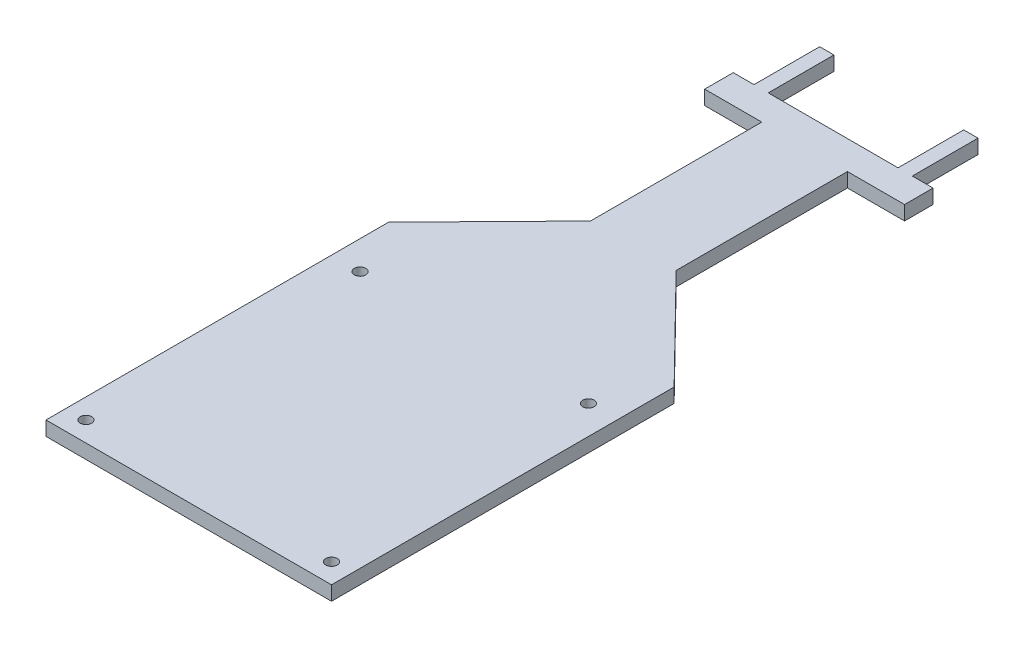
ISO-10303-21;
HEADER;
FILE_DESCRIPTION(('STEP AP214'),'2;1');
FILE_NAME('part.step','',(''),(''),'','','');
FILE_SCHEMA(('AUTOMOTIVE_DESIGN { 1 0 10303 214 1 1 1 1 }'));
ENDSEC;
DATA;
#1=APPLICATION_CONTEXT('core data for automotive mechanical design processes');
#2=APPLICATION_PROTOCOL_DEFINITION('international standard','automotive_design',2000,#1);
#3=PRODUCT_CONTEXT('',#1,'mechanical');
#4=PRODUCT('Part','Part','',(#3));
#5=PRODUCT_RELATED_PRODUCT_CATEGORY('part','',(#4));
#6=PRODUCT_DEFINITION_FORMATION('','',#4);
#7=PRODUCT_DEFINITION_CONTEXT('part definition',#1,'design');
#8=PRODUCT_DEFINITION('design','',#6,#7);
#9=PRODUCT_DEFINITION_SHAPE('','',#8);
#10=(LENGTH_UNIT() NAMED_UNIT(*) SI_UNIT(.MILLI.,.METRE.));
#11=(NAMED_UNIT(*) PLANE_ANGLE_UNIT() SI_UNIT($,.RADIAN.));
#12=(NAMED_UNIT(*) SI_UNIT($,.STERADIAN.) SOLID_ANGLE_UNIT());
#13=UNCERTAINTY_MEASURE_WITH_UNIT(LENGTH_MEASURE(1.E-05),#10,'distance_accuracy_value','');
#14=(GEOMETRIC_REPRESENTATION_CONTEXT(3) GLOBAL_UNCERTAINTY_ASSIGNED_CONTEXT((#13)) GLOBAL_UNIT_ASSIGNED_CONTEXT((#10,
#11,#12)) REPRESENTATION_CONTEXT('',''));
#15=CARTESIAN_POINT('',(0.,0.,0.));
#16=DIRECTION('',(0.,0.,1.));
#17=DIRECTION('',(1.,0.,0.));
#18=AXIS2_PLACEMENT_3D('',#15,#16,#17);
#19=CARTESIAN_POINT('',(0.,5.,0.));
#20=DIRECTION('',(0.,1.,0.));
#21=DIRECTION('',(0.,0.,1.));
#22=AXIS2_PLACEMENT_3D('',#19,#20,#21);
#23=PLANE('',#22);
#24=CARTESIAN_POINT('',(-43.,5.,53.));
#25=DIRECTION('',(0.,1.,0.));
#26=DIRECTION('',(0.,0.,1.));
#27=AXIS2_PLACEMENT_3D('',#24,#25,#26);
#28=CIRCLE('',#27,2.);
#29=CARTESIAN_POINT('',(-43.,5.,55.));
#30=VERTEX_POINT('',#29);
#31=EDGE_CURVE('E470',#30,#30,#28,.T.);
#32=ORIENTED_EDGE('',*,*,#31,.F.);
#33=EDGE_LOOP('',(#32));
#34=FACE_BOUND('',#33,.T.);
#35=CARTESIAN_POINT('',(40.,5.,-40.));
#36=DIRECTION('',(0.,1.,0.));
#37=DIRECTION('',(0.,0.,1.));
#38=AXIS2_PLACEMENT_3D('',#35,#36,#37);
#39=CIRCLE('',#38,2.);
#40=CARTESIAN_POINT('',(40.,5.,-38.));
#41=VERTEX_POINT('',#40);
#42=EDGE_CURVE('E228',#41,#41,#39,.T.);
#43=ORIENTED_EDGE('',*,*,#42,.F.);
#44=EDGE_LOOP('',(#43));
#45=FACE_BOUND('',#44,.T.);
#46=DIRECTION('',(0.,0.,-1.));
#47=VECTOR('',#46,1.);
#48=CARTESIAN_POINT('',(50.,5.,-60.));
#49=LINE('',#48,#47);
#50=CARTESIAN_POINT('',(50.,5.,60.));
#51=VERTEX_POINT('',#50);
#52=CARTESIAN_POINT('',(50.,5.,-60.));
#53=VERTEX_POINT('',#52);
#54=EDGE_CURVE('E282',#51,#53,#49,.T.);
#55=ORIENTED_EDGE('',*,*,#54,.T.);
#56=DIRECTION('',(-0.700000000000001,0.,-0.714142842854284));
#57=VECTOR('',#56,1.);
#58=CARTESIAN_POINT('',(50.,5.,-60.));
#59=LINE('',#58,#57);
#60=CARTESIAN_POINT('',(15.,5.,-95.7071421427142));
#61=VERTEX_POINT('',#60);
#62=EDGE_CURVE('E146',#53,#61,#59,.T.);
#63=ORIENTED_EDGE('',*,*,#62,.T.);
#64=DIRECTION('',(0.,0.,-1.));
#65=VECTOR('',#64,1.);
#66=CARTESIAN_POINT('',(15.,5.,-155.707142142714));
#67=LINE('',#66,#65);
#68=CARTESIAN_POINT('',(15.,5.,-155.707142142714));
#69=VERTEX_POINT('',#68);
#70=EDGE_CURVE('E351',#61,#69,#67,.T.);
#71=ORIENTED_EDGE('',*,*,#70,.T.);
#72=DIRECTION('',(1.,0.,0.));
#73=VECTOR('',#72,1.);
#74=CARTESIAN_POINT('',(35.,5.,-155.707142142714));
#75=LINE('',#74,#73);
#76=CARTESIAN_POINT('',(35.,5.,-155.707142142714));
#77=VERTEX_POINT('',#76);
#78=EDGE_CURVE('E371',#69,#77,#75,.T.);
#79=ORIENTED_EDGE('',*,*,#78,.T.);
#80=DIRECTION('',(0.,0.,-1.));
#81=VECTOR('',#80,1.);
#82=CARTESIAN_POINT('',(35.,5.,-155.707142142714));
#83=LINE('',#82,#81);
#84=CARTESIAN_POINT('',(35.,5.,-165.707142142714));
#85=VERTEX_POINT('',#84);
#86=EDGE_CURVE('E367',#77,#85,#83,.T.);
#87=ORIENTED_EDGE('',*,*,#86,.T.);
#88=DIRECTION('',(-1.,0.,0.));
#89=VECTOR('',#88,1.);
#90=CARTESIAN_POINT('',(27.7289917777717,5.,-165.707142142714));
#91=LINE('',#90,#89);
#92=CARTESIAN_POINT('',(27.7289917777717,5.,-165.707142142714));
#93=VERTEX_POINT('',#92);
#94=EDGE_CURVE('E370',#85,#93,#91,.T.);
#95=ORIENTED_EDGE('',*,*,#94,.T.);
#96=DIRECTION('',(0.,0.,-1.));
#97=VECTOR('',#96,1.);
#98=CARTESIAN_POINT('',(27.7289917777717,5.,-165.707142142714));
#99=LINE('',#98,#97);
#100=CARTESIAN_POINT('',(27.7289917777717,5.,-188.707142142714));
#101=VERTEX_POINT('',#100);
#102=EDGE_CURVE('E375',#93,#101,#99,.T.);
#103=ORIENTED_EDGE('',*,*,#102,.T.);
#104=DIRECTION('',(-1.,0.,0.));
#105=VECTOR('',#104,1.);
#106=CARTESIAN_POINT('',(27.7289917777717,5.,-188.707142142714));
#107=LINE('',#106,#105);
#108=CARTESIAN_POINT('',(22.7289917777717,5.,-188.707142142714));
#109=VERTEX_POINT('',#108);
#110=EDGE_CURVE('E382',#101,#109,#107,.T.);
#111=ORIENTED_EDGE('',*,*,#110,.T.);
#112=DIRECTION('',(0.,0.,1.));
#113=VECTOR('',#112,1.);
#114=CARTESIAN_POINT('',(22.7289917777717,5.,-188.707142142714));
#115=LINE('',#114,#113);
#116=CARTESIAN_POINT('',(22.7289917777717,5.,-165.707142142714));
#117=VERTEX_POINT('',#116);
#118=EDGE_CURVE('E385',#109,#117,#115,.T.);
#119=ORIENTED_EDGE('',*,*,#118,.T.);
#120=DIRECTION('',(-1.,0.,0.));
#121=VECTOR('',#120,1.);
#122=CARTESIAN_POINT('',(-22.7289917777717,5.,-165.707142142714));
#123=LINE('',#122,#121);
#124=CARTESIAN_POINT('',(-22.7289917777717,5.,-165.707142142714));
#125=VERTEX_POINT('',#124);
#126=EDGE_CURVE('E388',#117,#125,#123,.T.);
#127=ORIENTED_EDGE('',*,*,#126,.T.);
#128=DIRECTION('',(0.,0.,-1.));
#129=VECTOR('',#128,1.);
#130=CARTESIAN_POINT('',(-22.7289917777717,5.,-188.707142142714));
#131=LINE('',#130,#129);
#132=CARTESIAN_POINT('',(-22.7289917777717,5.,-188.707142142714));
#133=VERTEX_POINT('',#132);
#134=EDGE_CURVE('E391',#125,#133,#131,.T.);
#135=ORIENTED_EDGE('',*,*,#134,.T.);
#136=DIRECTION('',(-1.,0.,0.));
#137=VECTOR('',#136,1.);
#138=CARTESIAN_POINT('',(-27.7289917777717,5.,-188.707142142714));
#139=LINE('',#138,#137);
#140=CARTESIAN_POINT('',(-27.7289917777717,5.,-188.707142142714));
#141=VERTEX_POINT('',#140);
#142=EDGE_CURVE('E394',#133,#141,#139,.T.);
#143=ORIENTED_EDGE('',*,*,#142,.T.);
#144=DIRECTION('',(0.,0.,1.));
#145=VECTOR('',#144,1.);
#146=CARTESIAN_POINT('',(-27.7289917777717,5.,-165.707142142714));
#147=LINE('',#146,#145);
#148=CARTESIAN_POINT('',(-27.7289917777717,5.,-165.707142142714));
#149=VERTEX_POINT('',#148);
#150=EDGE_CURVE('E397',#141,#149,#147,.T.);
#151=ORIENTED_EDGE('',*,*,#150,.T.);
#152=DIRECTION('',(-1.,0.,0.));
#153=VECTOR('',#152,1.);
#154=CARTESIAN_POINT('',(-35.,5.,-165.707142142714));
#155=LINE('',#154,#153);
#156=CARTESIAN_POINT('',(-35.,5.,-165.707142142714));
#157=VERTEX_POINT('',#156);
#158=EDGE_CURVE('E400',#149,#157,#155,.T.);
#159=ORIENTED_EDGE('',*,*,#158,.T.);
#160=DIRECTION('',(0.,0.,1.));
#161=VECTOR('',#160,1.);
#162=CARTESIAN_POINT('',(-35.,5.,-155.707142142714));
#163=LINE('',#162,#161);
#164=CARTESIAN_POINT('',(-35.,5.,-155.707142142714));
#165=VERTEX_POINT('',#164);
#166=EDGE_CURVE('E403',#157,#165,#163,.T.);
#167=ORIENTED_EDGE('',*,*,#166,.T.);
#168=DIRECTION('',(1.,0.,0.));
#169=VECTOR('',#168,1.);
#170=CARTESIAN_POINT('',(-35.,5.,-155.707142142714));
#171=LINE('',#170,#169);
#172=CARTESIAN_POINT('',(-15.,5.,-155.707142142714));
#173=VERTEX_POINT('',#172);
#174=EDGE_CURVE('E406',#165,#173,#171,.T.);
#175=ORIENTED_EDGE('',*,*,#174,.T.);
#176=DIRECTION('',(0.,0.,1.));
#177=VECTOR('',#176,1.);
#178=CARTESIAN_POINT('',(-15.,5.,-155.707142142714));
#179=LINE('',#178,#177);
#180=CARTESIAN_POINT('',(-15.,5.,-95.7071421427142));
#181=VERTEX_POINT('',#180);
#182=EDGE_CURVE('E201',#173,#181,#179,.T.);
#183=ORIENTED_EDGE('',*,*,#182,.T.);
#184=DIRECTION('',(-0.7,0.,0.714142842854285));
#185=VECTOR('',#184,1.);
#186=CARTESIAN_POINT('',(-50.,5.,-60.));
#187=LINE('',#186,#185);
#188=CARTESIAN_POINT('',(-50.,5.,-60.));
#189=VERTEX_POINT('',#188);
#190=EDGE_CURVE('E195',#181,#189,#187,.T.);
#191=ORIENTED_EDGE('',*,*,#190,.T.);
#192=DIRECTION('',(0.,0.,1.));
#193=VECTOR('',#192,1.);
#194=CARTESIAN_POINT('',(-50.,5.,-60.));
#195=LINE('',#194,#193);
#196=CARTESIAN_POINT('',(-50.,5.,60.));
#197=VERTEX_POINT('',#196);
#198=EDGE_CURVE('E199',#189,#197,#195,.T.);
#199=ORIENTED_EDGE('',*,*,#198,.T.);
#200=DIRECTION('',(1.,0.,0.));
#201=VECTOR('',#200,1.);
#202=CARTESIAN_POINT('',(-50.,5.,60.));
#203=LINE('',#202,#201);
#204=EDGE_CURVE('E67',#197,#51,#203,.T.);
#205=ORIENTED_EDGE('',*,*,#204,.T.);
#206=EDGE_LOOP('',(#55,#63,#71,#79,#87,#95,#103,#111,#119,#127,#135,#143,#151,#159,#167,#175,
#183,#191,#199,#205));
#207=FACE_BOUND('',#206,.T.);
#208=CARTESIAN_POINT('',(-40.,5.,-40.));
#209=DIRECTION('',(0.,1.,0.));
#210=DIRECTION('',(0.,0.,1.));
#211=AXIS2_PLACEMENT_3D('',#208,#209,#210);
#212=CIRCLE('',#211,2.);
#213=CARTESIAN_POINT('',(-40.,5.,-38.));
#214=VERTEX_POINT('',#213);
#215=EDGE_CURVE('E478',#214,#214,#212,.T.);
#216=ORIENTED_EDGE('',*,*,#215,.F.);
#217=EDGE_LOOP('',(#216));
#218=FACE_BOUND('',#217,.T.);
#219=CARTESIAN_POINT('',(43.,5.,52.9999999999999));
#220=DIRECTION('',(0.,1.,0.));
#221=DIRECTION('',(0.,0.,1.));
#222=AXIS2_PLACEMENT_3D('',#219,#220,#221);
#223=CIRCLE('',#222,2.);
#224=CARTESIAN_POINT('',(43.,5.,54.9999999999999));
#225=VERTEX_POINT('',#224);
#226=EDGE_CURVE('E459',#225,#225,#223,.T.);
#227=ORIENTED_EDGE('',*,*,#226,.F.);
#228=EDGE_LOOP('',(#227));
#229=FACE_BOUND('',#228,.T.);
#230=ADVANCED_FACE('F49',(#34,#45,#207,#218,#229),#23,.T.);
#231=CARTESIAN_POINT('',(0.,0.,0.));
#232=DIRECTION('',(0.,1.,0.));
#233=DIRECTION('',(0.,0.,1.));
#234=AXIS2_PLACEMENT_3D('',#231,#232,#233);
#235=PLANE('',#234);
#236=DIRECTION('',(0.,0.,-1.));
#237=VECTOR('',#236,1.);
#238=CARTESIAN_POINT('',(50.,0.,-60.));
#239=LINE('',#238,#237);
#240=CARTESIAN_POINT('',(50.,0.,60.));
#241=VERTEX_POINT('',#240);
#242=CARTESIAN_POINT('',(50.,0.,-60.));
#243=VERTEX_POINT('',#242);
#244=EDGE_CURVE('E223',#241,#243,#239,.T.);
#245=ORIENTED_EDGE('',*,*,#244,.F.);
#246=DIRECTION('',(1.,0.,0.));
#247=VECTOR('',#246,1.);
#248=CARTESIAN_POINT('',(-50.,0.,60.));
#249=LINE('',#248,#247);
#250=CARTESIAN_POINT('',(-50.,0.,60.));
#251=VERTEX_POINT('',#250);
#252=EDGE_CURVE('E138',#251,#241,#249,.T.);
#253=ORIENTED_EDGE('',*,*,#252,.F.);
#254=DIRECTION('',(0.,0.,1.));
#255=VECTOR('',#254,1.);
#256=CARTESIAN_POINT('',(-50.,0.,-60.));
#257=LINE('',#256,#255);
#258=CARTESIAN_POINT('',(-50.,0.,-60.));
#259=VERTEX_POINT('',#258);
#260=EDGE_CURVE('E132',#259,#251,#257,.T.);
#261=ORIENTED_EDGE('',*,*,#260,.F.);
#262=DIRECTION('',(-0.7,0.,0.714142842854285));
#263=VECTOR('',#262,1.);
#264=CARTESIAN_POINT('',(-50.,0.,-60.));
#265=LINE('',#264,#263);
#266=CARTESIAN_POINT('',(-15.,0.,-95.7071421427142));
#267=VERTEX_POINT('',#266);
#268=EDGE_CURVE('E210',#267,#259,#265,.T.);
#269=ORIENTED_EDGE('',*,*,#268,.F.);
#270=DIRECTION('',(0.,0.,1.));
#271=VECTOR('',#270,1.);
#272=CARTESIAN_POINT('',(-15.,0.,-155.707142142714));
#273=LINE('',#272,#271);
#274=CARTESIAN_POINT('',(-15.,0.,-155.707142142714));
#275=VERTEX_POINT('',#274);
#276=EDGE_CURVE('E273',#275,#267,#273,.T.);
#277=ORIENTED_EDGE('',*,*,#276,.F.);
#278=DIRECTION('',(1.,0.,0.));
#279=VECTOR('',#278,1.);
#280=CARTESIAN_POINT('',(-35.,0.,-155.707142142714));
#281=LINE('',#280,#279);
#282=CARTESIAN_POINT('',(-35.,0.,-155.707142142714));
#283=VERTEX_POINT('',#282);
#284=EDGE_CURVE('E270',#283,#275,#281,.T.);
#285=ORIENTED_EDGE('',*,*,#284,.F.);
#286=DIRECTION('',(0.,0.,1.));
#287=VECTOR('',#286,1.);
#288=CARTESIAN_POINT('',(-35.,0.,-155.707142142714));
#289=LINE('',#288,#287);
#290=CARTESIAN_POINT('',(-35.,0.,-165.707142142714));
#291=VERTEX_POINT('',#290);
#292=EDGE_CURVE('E267',#291,#283,#289,.T.);
#293=ORIENTED_EDGE('',*,*,#292,.F.);
#294=DIRECTION('',(-1.,0.,0.));
#295=VECTOR('',#294,1.);
#296=CARTESIAN_POINT('',(-35.,0.,-165.707142142714));
#297=LINE('',#296,#295);
#298=CARTESIAN_POINT('',(-27.7289917777717,0.,-165.707142142714));
#299=VERTEX_POINT('',#298);
#300=EDGE_CURVE('E264',#299,#291,#297,.T.);
#301=ORIENTED_EDGE('',*,*,#300,.F.);
#302=DIRECTION('',(0.,0.,1.));
#303=VECTOR('',#302,1.);
#304=CARTESIAN_POINT('',(-27.7289917777717,0.,-165.707142142714));
#305=LINE('',#304,#303);
#306=CARTESIAN_POINT('',(-27.7289917777717,0.,-188.707142142714));
#307=VERTEX_POINT('',#306);
#308=EDGE_CURVE('E261',#307,#299,#305,.T.);
#309=ORIENTED_EDGE('',*,*,#308,.F.);
#310=DIRECTION('',(-1.,0.,0.));
#311=VECTOR('',#310,1.);
#312=CARTESIAN_POINT('',(-27.7289917777717,0.,-188.707142142714));
#313=LINE('',#312,#311);
#314=CARTESIAN_POINT('',(-22.7289917777717,0.,-188.707142142714));
#315=VERTEX_POINT('',#314);
#316=EDGE_CURVE('E258',#315,#307,#313,.T.);
#317=ORIENTED_EDGE('',*,*,#316,.F.);
#318=DIRECTION('',(0.,0.,-1.));
#319=VECTOR('',#318,1.);
#320=CARTESIAN_POINT('',(-22.7289917777717,0.,-188.707142142714));
#321=LINE('',#320,#319);
#322=CARTESIAN_POINT('',(-22.7289917777717,0.,-165.707142142714));
#323=VERTEX_POINT('',#322);
#324=EDGE_CURVE('E255',#323,#315,#321,.T.);
#325=ORIENTED_EDGE('',*,*,#324,.F.);
#326=DIRECTION('',(-1.,0.,0.));
#327=VECTOR('',#326,1.);
#328=CARTESIAN_POINT('',(-22.7289917777717,0.,-165.707142142714));
#329=LINE('',#328,#327);
#330=CARTESIAN_POINT('',(22.7289917777717,0.,-165.707142142714));
#331=VERTEX_POINT('',#330);
#332=EDGE_CURVE('E252',#331,#323,#329,.T.);
#333=ORIENTED_EDGE('',*,*,#332,.F.);
#334=DIRECTION('',(0.,0.,1.));
#335=VECTOR('',#334,1.);
#336=CARTESIAN_POINT('',(22.7289917777717,0.,-188.707142142714));
#337=LINE('',#336,#335);
#338=CARTESIAN_POINT('',(22.7289917777717,0.,-188.707142142714));
#339=VERTEX_POINT('',#338);
#340=EDGE_CURVE('E249',#339,#331,#337,.T.);
#341=ORIENTED_EDGE('',*,*,#340,.F.);
#342=DIRECTION('',(-1.,0.,0.));
#343=VECTOR('',#342,1.);
#344=CARTESIAN_POINT('',(27.7289917777717,0.,-188.707142142714));
#345=LINE('',#344,#343);
#346=CARTESIAN_POINT('',(27.7289917777717,0.,-188.707142142714));
#347=VERTEX_POINT('',#346);
#348=EDGE_CURVE('E246',#347,#339,#345,.T.);
#349=ORIENTED_EDGE('',*,*,#348,.F.);
#350=DIRECTION('',(0.,0.,-1.));
#351=VECTOR('',#350,1.);
#352=CARTESIAN_POINT('',(27.7289917777717,0.,-165.707142142714));
#353=LINE('',#352,#351);
#354=CARTESIAN_POINT('',(27.7289917777717,0.,-165.707142142714));
#355=VERTEX_POINT('',#354);
#356=EDGE_CURVE('E243',#355,#347,#353,.T.);
#357=ORIENTED_EDGE('',*,*,#356,.F.);
#358=DIRECTION('',(-1.,0.,0.));
#359=VECTOR('',#358,1.);
#360=CARTESIAN_POINT('',(27.7289917777717,0.,-165.707142142714));
#361=LINE('',#360,#359);
#362=CARTESIAN_POINT('',(35.,0.,-165.707142142714));
#363=VERTEX_POINT('',#362);
#364=EDGE_CURVE('E240',#363,#355,#361,.T.);
#365=ORIENTED_EDGE('',*,*,#364,.F.);
#366=DIRECTION('',(0.,0.,-1.));
#367=VECTOR('',#366,1.);
#368=CARTESIAN_POINT('',(35.,0.,-155.707142142714));
#369=LINE('',#368,#367);
#370=CARTESIAN_POINT('',(35.,0.,-155.707142142714));
#371=VERTEX_POINT('',#370);
#372=EDGE_CURVE('E237',#371,#363,#369,.T.);
#373=ORIENTED_EDGE('',*,*,#372,.F.);
#374=DIRECTION('',(1.,0.,0.));
#375=VECTOR('',#374,1.);
#376=CARTESIAN_POINT('',(35.,0.,-155.707142142714));
#377=LINE('',#376,#375);
#378=CARTESIAN_POINT('',(15.,0.,-155.707142142714));
#379=VERTEX_POINT('',#378);
#380=EDGE_CURVE('E234',#379,#371,#377,.T.);
#381=ORIENTED_EDGE('',*,*,#380,.F.);
#382=DIRECTION('',(0.,0.,-1.));
#383=VECTOR('',#382,1.);
#384=CARTESIAN_POINT('',(15.,0.,-155.707142142714));
#385=LINE('',#384,#383);
#386=CARTESIAN_POINT('',(15.,0.,-95.7071421427142));
#387=VERTEX_POINT('',#386);
#388=EDGE_CURVE('E231',#387,#379,#385,.T.);
#389=ORIENTED_EDGE('',*,*,#388,.F.);
#390=DIRECTION('',(-0.700000000000001,0.,-0.714142842854284));
#391=VECTOR('',#390,1.);
#392=CARTESIAN_POINT('',(50.,0.,-60.));
#393=LINE('',#392,#391);
#394=EDGE_CURVE('E227',#243,#387,#393,.T.);
#395=ORIENTED_EDGE('',*,*,#394,.F.);
#396=EDGE_LOOP('',(#245,#253,#261,#269,#277,#285,#293,#301,#309,#317,#325,#333,#341,#349,#357,
#365,#373,#381,#389,#395));
#397=FACE_BOUND('',#396,.T.);
#398=CARTESIAN_POINT('',(40.,0.,-40.));
#399=DIRECTION('',(0.,1.,0.));
#400=DIRECTION('',(0.,0.,1.));
#401=AXIS2_PLACEMENT_3D('',#398,#399,#400);
#402=CIRCLE('',#401,2.);
#403=CARTESIAN_POINT('',(40.,0.,-38.));
#404=VERTEX_POINT('',#403);
#405=EDGE_CURVE('E482',#404,#404,#402,.T.);
#406=ORIENTED_EDGE('',*,*,#405,.T.);
#407=EDGE_LOOP('',(#406));
#408=FACE_BOUND('',#407,.T.);
#409=CARTESIAN_POINT('',(-40.,0.,-40.));
#410=DIRECTION('',(0.,1.,0.));
#411=DIRECTION('',(0.,0.,1.));
#412=AXIS2_PLACEMENT_3D('',#409,#410,#411);
#413=CIRCLE('',#412,2.);
#414=CARTESIAN_POINT('',(-40.,0.,-38.));
#415=VERTEX_POINT('',#414);
#416=EDGE_CURVE('E474',#415,#415,#413,.T.);
#417=ORIENTED_EDGE('',*,*,#416,.T.);
#418=EDGE_LOOP('',(#417));
#419=FACE_BOUND('',#418,.T.);
#420=CARTESIAN_POINT('',(-43.,0.,53.));
#421=DIRECTION('',(0.,1.,0.));
#422=DIRECTION('',(0.,0.,1.));
#423=AXIS2_PLACEMENT_3D('',#420,#421,#422);
#424=CIRCLE('',#423,2.);
#425=CARTESIAN_POINT('',(-43.,0.,55.));
#426=VERTEX_POINT('',#425);
#427=EDGE_CURVE('E467',#426,#426,#424,.T.);
#428=ORIENTED_EDGE('',*,*,#427,.T.);
#429=EDGE_LOOP('',(#428));
#430=FACE_BOUND('',#429,.T.);
#431=CARTESIAN_POINT('',(43.,0.,52.9999999999999));
#432=DIRECTION('',(0.,1.,0.));
#433=DIRECTION('',(0.,0.,1.));
#434=AXIS2_PLACEMENT_3D('',#431,#432,#433);
#435=CIRCLE('',#434,2.);
#436=CARTESIAN_POINT('',(43.,0.,54.9999999999999));
#437=VERTEX_POINT('',#436);
#438=EDGE_CURVE('E462',#437,#437,#435,.T.);
#439=ORIENTED_EDGE('',*,*,#438,.T.);
#440=EDGE_LOOP('',(#439));
#441=FACE_BOUND('',#440,.T.);
#442=ADVANCED_FACE('F355',(#397,#408,#419,#430,#441),#235,.F.);
#443=CARTESIAN_POINT('',(50.,5.,-60.));
#444=DIRECTION('',(-1.,0.,0.));
#445=DIRECTION('',(0.,0.,1.));
#446=AXIS2_PLACEMENT_3D('',#443,#444,#445);
#447=PLANE('',#446);
#448=ORIENTED_EDGE('',*,*,#244,.T.);
#449=DIRECTION('',(0.,-1.,0.));
#450=VECTOR('',#449,1.);
#451=CARTESIAN_POINT('',(50.,5.,-60.));
#452=LINE('',#451,#450);
#453=EDGE_CURVE('E11',#53,#243,#452,.T.);
#454=ORIENTED_EDGE('',*,*,#453,.F.);
#455=ORIENTED_EDGE('',*,*,#54,.F.);
#456=DIRECTION('',(0.,-1.,0.));
#457=VECTOR('',#456,1.);
#458=CARTESIAN_POINT('',(50.,5.,60.));
#459=LINE('',#458,#457);
#460=EDGE_CURVE('E219',#51,#241,#459,.T.);
#461=ORIENTED_EDGE('',*,*,#460,.T.);
#462=EDGE_LOOP('',(#448,#454,#455,#461));
#463=FACE_BOUND('',#462,.T.);
#464=ADVANCED_FACE('F51',(#463),#447,.F.);
#465=CARTESIAN_POINT('',(50.,5.,-60.));
#466=DIRECTION('',(-0.714142842854284,0.,0.700000000000001));
#467=DIRECTION('',(0.700000000000001,0.,0.714142842854285));
#468=AXIS2_PLACEMENT_3D('',#465,#466,#467);
#469=PLANE('',#468);
#470=ORIENTED_EDGE('',*,*,#394,.T.);
#471=DIRECTION('',(0.,-1.,0.));
#472=VECTOR('',#471,1.);
#473=CARTESIAN_POINT('',(15.,5.,-95.7071421427142));
#474=LINE('',#473,#472);
#475=EDGE_CURVE('E59',#61,#387,#474,.T.);
#476=ORIENTED_EDGE('',*,*,#475,.F.);
#477=ORIENTED_EDGE('',*,*,#62,.F.);
#478=ORIENTED_EDGE('',*,*,#453,.T.);
#479=EDGE_LOOP('',(#470,#476,#477,#478));
#480=FACE_BOUND('',#479,.T.);
#481=ADVANCED_FACE('F656',(#480),#469,.F.);
#482=CARTESIAN_POINT('',(15.,5.,-155.707142142714));
#483=DIRECTION('',(-1.,0.,0.));
#484=DIRECTION('',(0.,0.,1.));
#485=AXIS2_PLACEMENT_3D('',#482,#483,#484);
#486=PLANE('',#485);
#487=ORIENTED_EDGE('',*,*,#388,.T.);
#488=DIRECTION('',(0.,-1.,0.));
#489=VECTOR('',#488,1.);
#490=CARTESIAN_POINT('',(15.,5.,-155.707142142714));
#491=LINE('',#490,#489);
#492=EDGE_CURVE('E341',#69,#379,#491,.T.);
#493=ORIENTED_EDGE('',*,*,#492,.F.);
#494=ORIENTED_EDGE('',*,*,#70,.F.);
#495=ORIENTED_EDGE('',*,*,#475,.T.);
#496=EDGE_LOOP('',(#487,#493,#494,#495));
#497=FACE_BOUND('',#496,.T.);
#498=ADVANCED_FACE('F349',(#497),#486,.F.);
#499=CARTESIAN_POINT('',(35.,5.,-155.707142142714));
#500=DIRECTION('',(0.,0.,-1.));
#501=DIRECTION('',(-1.,0.,0.));
#502=AXIS2_PLACEMENT_3D('',#499,#500,#501);
#503=PLANE('',#502);
#504=ORIENTED_EDGE('',*,*,#380,.T.);
#505=DIRECTION('',(0.,-1.,0.));
#506=VECTOR('',#505,1.);
#507=CARTESIAN_POINT('',(35.,5.,-155.707142142714));
#508=LINE('',#507,#506);
#509=EDGE_CURVE('E337',#77,#371,#508,.T.);
#510=ORIENTED_EDGE('',*,*,#509,.F.);
#511=ORIENTED_EDGE('',*,*,#78,.F.);
#512=ORIENTED_EDGE('',*,*,#492,.T.);
#513=EDGE_LOOP('',(#504,#510,#511,#512));
#514=FACE_BOUND('',#513,.T.);
#515=ADVANCED_FACE('F361',(#514),#503,.F.);
#516=CARTESIAN_POINT('',(35.,5.,-155.707142142714));
#517=DIRECTION('',(-1.,0.,0.));
#518=DIRECTION('',(0.,0.,1.));
#519=AXIS2_PLACEMENT_3D('',#516,#517,#518);
#520=PLANE('',#519);
#521=ORIENTED_EDGE('',*,*,#372,.T.);
#522=DIRECTION('',(0.,-1.,0.));
#523=VECTOR('',#522,1.);
#524=CARTESIAN_POINT('',(35.,5.,-165.707142142714));
#525=LINE('',#524,#523);
#526=EDGE_CURVE('E333',#85,#363,#525,.T.);
#527=ORIENTED_EDGE('',*,*,#526,.F.);
#528=ORIENTED_EDGE('',*,*,#86,.F.);
#529=ORIENTED_EDGE('',*,*,#509,.T.);
#530=EDGE_LOOP('',(#521,#527,#528,#529));
#531=FACE_BOUND('',#530,.T.);
#532=ADVANCED_FACE('F365',(#531),#520,.F.);
#533=CARTESIAN_POINT('',(27.7289917777717,5.,-165.707142142714));
#534=DIRECTION('',(0.,0.,1.));
#535=DIRECTION('',(1.,0.,0.));
#536=AXIS2_PLACEMENT_3D('',#533,#534,#535);
#537=PLANE('',#536);
#538=ORIENTED_EDGE('',*,*,#364,.T.);
#539=DIRECTION('',(0.,-1.,0.));
#540=VECTOR('',#539,1.);
#541=CARTESIAN_POINT('',(27.7289917777717,5.,-165.707142142714));
#542=LINE('',#541,#540);
#543=EDGE_CURVE('E329',#93,#355,#542,.T.);
#544=ORIENTED_EDGE('',*,*,#543,.F.);
#545=ORIENTED_EDGE('',*,*,#94,.F.);
#546=ORIENTED_EDGE('',*,*,#526,.T.);
#547=EDGE_LOOP('',(#538,#544,#545,#546));
#548=FACE_BOUND('',#547,.T.);
#549=ADVANCED_FACE('F625',(#548),#537,.F.);
#550=CARTESIAN_POINT('',(27.7289917777717,5.,-165.707142142714));
#551=DIRECTION('',(-1.,0.,0.));
#552=DIRECTION('',(0.,0.,1.));
#553=AXIS2_PLACEMENT_3D('',#550,#551,#552);
#554=PLANE('',#553);
#555=ORIENTED_EDGE('',*,*,#356,.T.);
#556=DIRECTION('',(0.,-1.,0.));
#557=VECTOR('',#556,1.);
#558=CARTESIAN_POINT('',(27.7289917777717,5.,-188.707142142714));
#559=LINE('',#558,#557);
#560=EDGE_CURVE('E325',#101,#347,#559,.T.);
#561=ORIENTED_EDGE('',*,*,#560,.F.);
#562=ORIENTED_EDGE('',*,*,#102,.F.);
#563=ORIENTED_EDGE('',*,*,#543,.T.);
#564=EDGE_LOOP('',(#555,#561,#562,#563));
#565=FACE_BOUND('',#564,.T.);
#566=ADVANCED_FACE('F616',(#565),#554,.F.);
#567=CARTESIAN_POINT('',(27.7289917777717,5.,-188.707142142714));
#568=DIRECTION('',(0.,0.,1.));
#569=DIRECTION('',(1.,0.,0.));
#570=AXIS2_PLACEMENT_3D('',#567,#568,#569);
#571=PLANE('',#570);
#572=ORIENTED_EDGE('',*,*,#348,.T.);
#573=DIRECTION('',(0.,-1.,0.));
#574=VECTOR('',#573,1.);
#575=CARTESIAN_POINT('',(22.7289917777717,5.,-188.707142142714));
#576=LINE('',#575,#574);
#577=EDGE_CURVE('E321',#109,#339,#576,.T.);
#578=ORIENTED_EDGE('',*,*,#577,.F.);
#579=ORIENTED_EDGE('',*,*,#110,.F.);
#580=ORIENTED_EDGE('',*,*,#560,.T.);
#581=EDGE_LOOP('',(#572,#578,#579,#580));
#582=FACE_BOUND('',#581,.T.);
#583=ADVANCED_FACE('F607',(#582),#571,.F.);
#584=CARTESIAN_POINT('',(22.7289917777717,5.,-188.707142142714));
#585=DIRECTION('',(1.,0.,0.));
#586=DIRECTION('',(0.,0.,-1.));
#587=AXIS2_PLACEMENT_3D('',#584,#585,#586);
#588=PLANE('',#587);
#589=ORIENTED_EDGE('',*,*,#340,.T.);
#590=DIRECTION('',(0.,-1.,0.));
#591=VECTOR('',#590,1.);
#592=CARTESIAN_POINT('',(22.7289917777717,5.,-165.707142142714));
#593=LINE('',#592,#591);
#594=EDGE_CURVE('E317',#117,#331,#593,.T.);
#595=ORIENTED_EDGE('',*,*,#594,.F.);
#596=ORIENTED_EDGE('',*,*,#118,.F.);
#597=ORIENTED_EDGE('',*,*,#577,.T.);
#598=EDGE_LOOP('',(#589,#595,#596,#597));
#599=FACE_BOUND('',#598,.T.);
#600=ADVANCED_FACE('F598',(#599),#588,.F.);
#601=CARTESIAN_POINT('',(-22.7289917777717,5.,-165.707142142714));
#602=DIRECTION('',(0.,0.,1.));
#603=DIRECTION('',(1.,0.,0.));
#604=AXIS2_PLACEMENT_3D('',#601,#602,#603);
#605=PLANE('',#604);
#606=ORIENTED_EDGE('',*,*,#332,.T.);
#607=DIRECTION('',(0.,-1.,0.));
#608=VECTOR('',#607,1.);
#609=CARTESIAN_POINT('',(-22.7289917777717,5.,-165.707142142714));
#610=LINE('',#609,#608);
#611=EDGE_CURVE('E313',#125,#323,#610,.T.);
#612=ORIENTED_EDGE('',*,*,#611,.F.);
#613=ORIENTED_EDGE('',*,*,#126,.F.);
#614=ORIENTED_EDGE('',*,*,#594,.T.);
#615=EDGE_LOOP('',(#606,#612,#613,#614));
#616=FACE_BOUND('',#615,.T.);
#617=ADVANCED_FACE('F589',(#616),#605,.F.);
#618=CARTESIAN_POINT('',(-22.7289917777717,5.,-188.707142142714));
#619=DIRECTION('',(-1.,0.,0.));
#620=DIRECTION('',(0.,0.,1.));
#621=AXIS2_PLACEMENT_3D('',#618,#619,#620);
#622=PLANE('',#621);
#623=ORIENTED_EDGE('',*,*,#324,.T.);
#624=DIRECTION('',(0.,-1.,0.));
#625=VECTOR('',#624,1.);
#626=CARTESIAN_POINT('',(-22.7289917777717,5.,-188.707142142714));
#627=LINE('',#626,#625);
#628=EDGE_CURVE('E309',#133,#315,#627,.T.);
#629=ORIENTED_EDGE('',*,*,#628,.F.);
#630=ORIENTED_EDGE('',*,*,#134,.F.);
#631=ORIENTED_EDGE('',*,*,#611,.T.);
#632=EDGE_LOOP('',(#623,#629,#630,#631));
#633=FACE_BOUND('',#632,.T.);
#634=ADVANCED_FACE('F580',(#633),#622,.F.);
#635=CARTESIAN_POINT('',(-27.7289917777717,5.,-188.707142142714));
#636=DIRECTION('',(0.,0.,1.));
#637=DIRECTION('',(1.,0.,0.));
#638=AXIS2_PLACEMENT_3D('',#635,#636,#637);
#639=PLANE('',#638);
#640=ORIENTED_EDGE('',*,*,#316,.T.);
#641=DIRECTION('',(0.,-1.,0.));
#642=VECTOR('',#641,1.);
#643=CARTESIAN_POINT('',(-27.7289917777717,5.,-188.707142142714));
#644=LINE('',#643,#642);
#645=EDGE_CURVE('E305',#141,#307,#644,.T.);
#646=ORIENTED_EDGE('',*,*,#645,.F.);
#647=ORIENTED_EDGE('',*,*,#142,.F.);
#648=ORIENTED_EDGE('',*,*,#628,.T.);
#649=EDGE_LOOP('',(#640,#646,#647,#648));
#650=FACE_BOUND('',#649,.T.);
#651=ADVANCED_FACE('F571',(#650),#639,.F.);
#652=CARTESIAN_POINT('',(-27.7289917777717,5.,-165.707142142714));
#653=DIRECTION('',(1.,0.,0.));
#654=DIRECTION('',(0.,0.,-1.));
#655=AXIS2_PLACEMENT_3D('',#652,#653,#654);
#656=PLANE('',#655);
#657=ORIENTED_EDGE('',*,*,#308,.T.);
#658=DIRECTION('',(0.,-1.,0.));
#659=VECTOR('',#658,1.);
#660=CARTESIAN_POINT('',(-27.7289917777717,5.,-165.707142142714));
#661=LINE('',#660,#659);
#662=EDGE_CURVE('E301',#149,#299,#661,.T.);
#663=ORIENTED_EDGE('',*,*,#662,.F.);
#664=ORIENTED_EDGE('',*,*,#150,.F.);
#665=ORIENTED_EDGE('',*,*,#645,.T.);
#666=EDGE_LOOP('',(#657,#663,#664,#665));
#667=FACE_BOUND('',#666,.T.);
#668=ADVANCED_FACE('F562',(#667),#656,.F.);
#669=CARTESIAN_POINT('',(-35.,5.,-165.707142142714));
#670=DIRECTION('',(0.,0.,1.));
#671=DIRECTION('',(1.,0.,0.));
#672=AXIS2_PLACEMENT_3D('',#669,#670,#671);
#673=PLANE('',#672);
#674=ORIENTED_EDGE('',*,*,#300,.T.);
#675=DIRECTION('',(0.,-1.,0.));
#676=VECTOR('',#675,1.);
#677=CARTESIAN_POINT('',(-35.,5.,-165.707142142714));
#678=LINE('',#677,#676);
#679=EDGE_CURVE('E297',#157,#291,#678,.T.);
#680=ORIENTED_EDGE('',*,*,#679,.F.);
#681=ORIENTED_EDGE('',*,*,#158,.F.);
#682=ORIENTED_EDGE('',*,*,#662,.T.);
#683=EDGE_LOOP('',(#674,#680,#681,#682));
#684=FACE_BOUND('',#683,.T.);
#685=ADVANCED_FACE('F553',(#684),#673,.F.);
#686=CARTESIAN_POINT('',(-35.,5.,-155.707142142714));
#687=DIRECTION('',(1.,0.,0.));
#688=DIRECTION('',(0.,0.,-1.));
#689=AXIS2_PLACEMENT_3D('',#686,#687,#688);
#690=PLANE('',#689);
#691=ORIENTED_EDGE('',*,*,#292,.T.);
#692=DIRECTION('',(0.,-1.,0.));
#693=VECTOR('',#692,1.);
#694=CARTESIAN_POINT('',(-35.,5.,-155.707142142714));
#695=LINE('',#694,#693);
#696=EDGE_CURVE('E293',#165,#283,#695,.T.);
#697=ORIENTED_EDGE('',*,*,#696,.F.);
#698=ORIENTED_EDGE('',*,*,#166,.F.);
#699=ORIENTED_EDGE('',*,*,#679,.T.);
#700=EDGE_LOOP('',(#691,#697,#698,#699));
#701=FACE_BOUND('',#700,.T.);
#702=ADVANCED_FACE('F545',(#701),#690,.F.);
#703=CARTESIAN_POINT('',(-35.,5.,-155.707142142714));
#704=DIRECTION('',(0.,0.,-1.));
#705=DIRECTION('',(-1.,0.,0.));
#706=AXIS2_PLACEMENT_3D('',#703,#704,#705);
#707=PLANE('',#706);
#708=ORIENTED_EDGE('',*,*,#284,.T.);
#709=DIRECTION('',(0.,-1.,0.));
#710=VECTOR('',#709,1.);
#711=CARTESIAN_POINT('',(-15.,5.,-155.707142142714));
#712=LINE('',#711,#710);
#713=EDGE_CURVE('E289',#173,#275,#712,.T.);
#714=ORIENTED_EDGE('',*,*,#713,.F.);
#715=ORIENTED_EDGE('',*,*,#174,.F.);
#716=ORIENTED_EDGE('',*,*,#696,.T.);
#717=EDGE_LOOP('',(#708,#714,#715,#716));
#718=FACE_BOUND('',#717,.T.);
#719=ADVANCED_FACE('F414',(#718),#707,.F.);
#720=CARTESIAN_POINT('',(-15.,5.,-155.707142142714));
#721=DIRECTION('',(1.,0.,0.));
#722=DIRECTION('',(0.,0.,-1.));
#723=AXIS2_PLACEMENT_3D('',#720,#721,#722);
#724=PLANE('',#723);
#725=ORIENTED_EDGE('',*,*,#276,.T.);
#726=DIRECTION('',(0.,-1.,0.));
#727=VECTOR('',#726,1.);
#728=CARTESIAN_POINT('',(-15.,5.,-95.7071421427142));
#729=LINE('',#728,#727);
#730=EDGE_CURVE('E212',#181,#267,#729,.T.);
#731=ORIENTED_EDGE('',*,*,#730,.F.);
#732=ORIENTED_EDGE('',*,*,#182,.F.);
#733=ORIENTED_EDGE('',*,*,#713,.T.);
#734=EDGE_LOOP('',(#725,#731,#732,#733));
#735=FACE_BOUND('',#734,.T.);
#736=ADVANCED_FACE('F418',(#735),#724,.F.);
#737=CARTESIAN_POINT('',(-50.,5.,-60.));
#738=DIRECTION('',(0.714142842854285,0.,0.7));
#739=DIRECTION('',(0.7,0.,-0.714142842854285));
#740=AXIS2_PLACEMENT_3D('',#737,#738,#739);
#741=PLANE('',#740);
#742=ORIENTED_EDGE('',*,*,#268,.T.);
#743=DIRECTION('',(0.,-1.,0.));
#744=VECTOR('',#743,1.);
#745=CARTESIAN_POINT('',(-50.,5.,-60.));
#746=LINE('',#745,#744);
#747=EDGE_CURVE('E207',#189,#259,#746,.T.);
#748=ORIENTED_EDGE('',*,*,#747,.F.);
#749=ORIENTED_EDGE('',*,*,#190,.F.);
#750=ORIENTED_EDGE('',*,*,#730,.T.);
#751=EDGE_LOOP('',(#742,#748,#749,#750));
#752=FACE_BOUND('',#751,.T.);
#753=ADVANCED_FACE('F208',(#752),#741,.F.);
#754=CARTESIAN_POINT('',(-50.,5.,-60.));
#755=DIRECTION('',(1.,0.,0.));
#756=DIRECTION('',(0.,0.,-1.));
#757=AXIS2_PLACEMENT_3D('',#754,#755,#756);
#758=PLANE('',#757);
#759=ORIENTED_EDGE('',*,*,#260,.T.);
#760=DIRECTION('',(0.,-1.,0.));
#761=VECTOR('',#760,1.);
#762=CARTESIAN_POINT('',(-50.,5.,60.));
#763=LINE('',#762,#761);
#764=EDGE_CURVE('E213',#197,#251,#763,.T.);
#765=ORIENTED_EDGE('',*,*,#764,.F.);
#766=ORIENTED_EDGE('',*,*,#198,.F.);
#767=ORIENTED_EDGE('',*,*,#747,.T.);
#768=EDGE_LOOP('',(#759,#765,#766,#767));
#769=FACE_BOUND('',#768,.T.);
#770=ADVANCED_FACE('F215',(#769),#758,.F.);
#771=CARTESIAN_POINT('',(-50.,5.,60.));
#772=DIRECTION('',(0.,0.,-1.));
#773=DIRECTION('',(-1.,0.,0.));
#774=AXIS2_PLACEMENT_3D('',#771,#772,#773);
#775=PLANE('',#774);
#776=ORIENTED_EDGE('',*,*,#252,.T.);
#777=ORIENTED_EDGE('',*,*,#460,.F.);
#778=ORIENTED_EDGE('',*,*,#204,.F.);
#779=ORIENTED_EDGE('',*,*,#764,.T.);
#780=EDGE_LOOP('',(#776,#777,#778,#779));
#781=FACE_BOUND('',#780,.T.);
#782=ADVANCED_FACE('F422',(#781),#775,.F.);
#783=CARTESIAN_POINT('',(40.,5.,-40.));
#784=DIRECTION('',(0.,-1.,0.));
#785=DIRECTION('',(0.,0.,-1.));
#786=AXIS2_PLACEMENT_3D('',#783,#784,#785);
#787=CYLINDRICAL_SURFACE('',#786,2.);
#788=ORIENTED_EDGE('',*,*,#42,.T.);
#789=EDGE_LOOP('',(#788));
#790=FACE_BOUND('',#789,.T.);
#791=ORIENTED_EDGE('',*,*,#405,.F.);
#792=EDGE_LOOP('',(#791));
#793=FACE_BOUND('',#792,.T.);
#794=ADVANCED_FACE('F424',(#790,#793),#787,.F.);
#795=CARTESIAN_POINT('',(-40.,5.,-40.));
#796=DIRECTION('',(0.,-1.,0.));
#797=DIRECTION('',(0.,0.,-1.));
#798=AXIS2_PLACEMENT_3D('',#795,#796,#797);
#799=CYLINDRICAL_SURFACE('',#798,2.);
#800=ORIENTED_EDGE('',*,*,#215,.T.);
#801=EDGE_LOOP('',(#800));
#802=FACE_BOUND('',#801,.T.);
#803=ORIENTED_EDGE('',*,*,#416,.F.);
#804=EDGE_LOOP('',(#803));
#805=FACE_BOUND('',#804,.T.);
#806=ADVANCED_FACE('F430',(#802,#805),#799,.F.);
#807=CARTESIAN_POINT('',(-43.,5.,53.));
#808=DIRECTION('',(0.,-1.,0.));
#809=DIRECTION('',(0.,0.,-1.));
#810=AXIS2_PLACEMENT_3D('',#807,#808,#809);
#811=CYLINDRICAL_SURFACE('',#810,2.);
#812=ORIENTED_EDGE('',*,*,#31,.T.);
#813=EDGE_LOOP('',(#812));
#814=FACE_BOUND('',#813,.T.);
#815=ORIENTED_EDGE('',*,*,#427,.F.);
#816=EDGE_LOOP('',(#815));
#817=FACE_BOUND('',#816,.T.);
#818=ADVANCED_FACE('F446',(#814,#817),#811,.F.);
#819=CARTESIAN_POINT('',(43.,5.,52.9999999999999));
#820=DIRECTION('',(0.,-1.,0.));
#821=DIRECTION('',(0.,0.,-1.));
#822=AXIS2_PLACEMENT_3D('',#819,#820,#821);
#823=CYLINDRICAL_SURFACE('',#822,2.);
#824=ORIENTED_EDGE('',*,*,#226,.T.);
#825=EDGE_LOOP('',(#824));
#826=FACE_BOUND('',#825,.T.);
#827=ORIENTED_EDGE('',*,*,#438,.F.);
#828=EDGE_LOOP('',(#827));
#829=FACE_BOUND('',#828,.T.);
#830=ADVANCED_FACE('F450',(#826,#829),#823,.F.);
#831=CLOSED_SHELL('',(#230,#442,#464,#481,#498,#515,#532,#549,#566,#583,#600,#617,#634,#651,
#668,#685,#702,#719,#736,#753,#770,#782,#794,#806,#818,#830));
#832=MANIFOLD_SOLID_BREP('B2',#831);
#833=ADVANCED_BREP_SHAPE_REPRESENTATION('',(#18,#832),#14);
#834=SHAPE_DEFINITION_REPRESENTATION(#9,#833);
ENDSEC;
END-ISO-10303-21;
